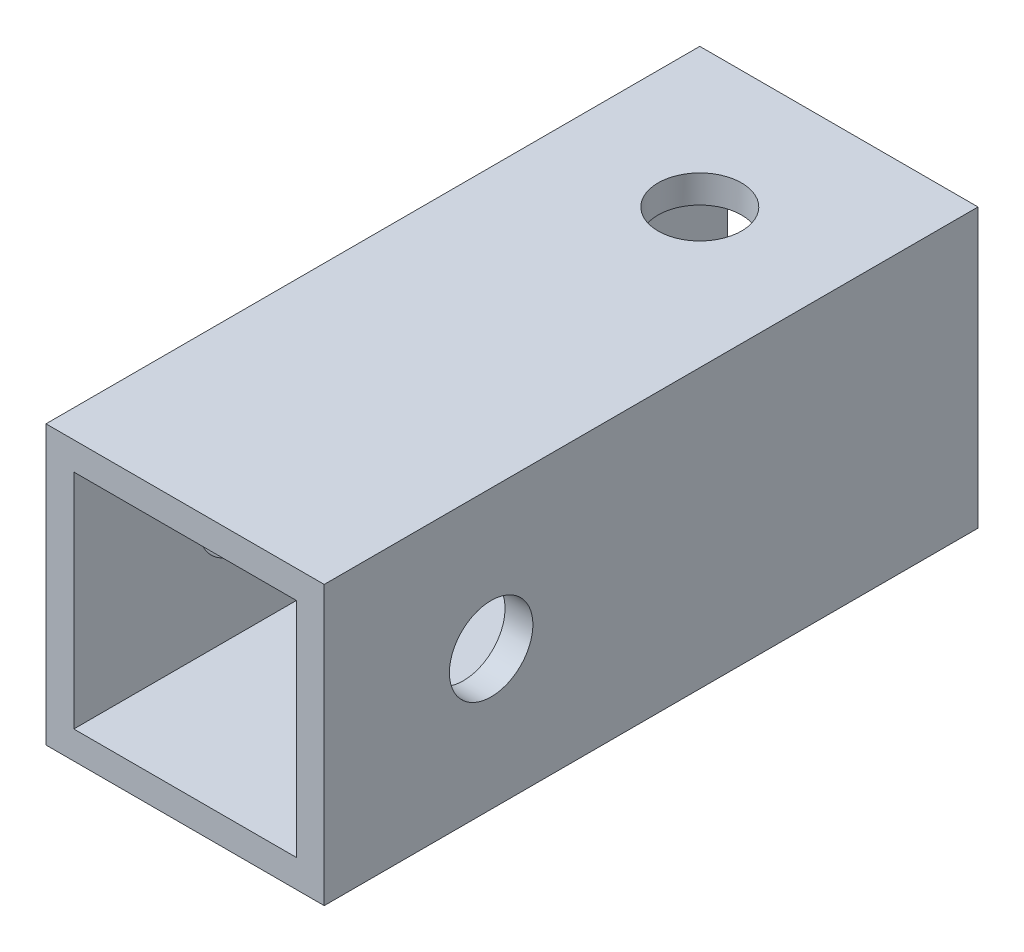
ISO-10303-21;
HEADER;
FILE_DESCRIPTION(('STEP AP214'),'2;1');
FILE_NAME('part.step','',(''),(''),'','','');
FILE_SCHEMA(('AUTOMOTIVE_DESIGN { 1 0 10303 214 1 1 1 1 }'));
ENDSEC;
DATA;
#1=APPLICATION_CONTEXT('core data for automotive mechanical design processes');
#2=APPLICATION_PROTOCOL_DEFINITION('international standard','automotive_design',2000,#1);
#3=PRODUCT_CONTEXT('',#1,'mechanical');
#4=PRODUCT('Part','Part','',(#3));
#5=PRODUCT_RELATED_PRODUCT_CATEGORY('part','',(#4));
#6=PRODUCT_DEFINITION_FORMATION('','',#4);
#7=PRODUCT_DEFINITION_CONTEXT('part definition',#1,'design');
#8=PRODUCT_DEFINITION('design','',#6,#7);
#9=PRODUCT_DEFINITION_SHAPE('','',#8);
#10=(LENGTH_UNIT() NAMED_UNIT(*) SI_UNIT(.MILLI.,.METRE.));
#11=(NAMED_UNIT(*) PLANE_ANGLE_UNIT() SI_UNIT($,.RADIAN.));
#12=(NAMED_UNIT(*) SI_UNIT($,.STERADIAN.) SOLID_ANGLE_UNIT());
#13=UNCERTAINTY_MEASURE_WITH_UNIT(LENGTH_MEASURE(1.E-05),#10,'distance_accuracy_value','');
#14=(GEOMETRIC_REPRESENTATION_CONTEXT(3) GLOBAL_UNCERTAINTY_ASSIGNED_CONTEXT((#13)) GLOBAL_UNIT_ASSIGNED_CONTEXT((#10,
#11,#12)) REPRESENTATION_CONTEXT('',''));
#15=CARTESIAN_POINT('',(0.,0.,0.));
#16=DIRECTION('',(0.,0.,1.));
#17=DIRECTION('',(1.,0.,0.));
#18=AXIS2_PLACEMENT_3D('',#15,#16,#17);
#19=CARTESIAN_POINT('',(0.,0.,23.5));
#20=DIRECTION('',(0.,0.,1.));
#21=DIRECTION('',(1.,0.,0.));
#22=AXIS2_PLACEMENT_3D('',#19,#20,#21);
#23=PLANE('',#22);
#24=DIRECTION('',(0.,1.,0.));
#25=VECTOR('',#24,1.);
#26=CARTESIAN_POINT('',(5.,-5.,23.5));
#27=LINE('',#26,#25);
#28=CARTESIAN_POINT('',(5.,-5.,23.5));
#29=VERTEX_POINT('',#28);
#30=CARTESIAN_POINT('',(5.,5.,23.5));
#31=VERTEX_POINT('',#30);
#32=EDGE_CURVE('E165',#29,#31,#27,.T.);
#33=ORIENTED_EDGE('',*,*,#32,.T.);
#34=DIRECTION('',(-1.,0.,0.));
#35=VECTOR('',#34,1.);
#36=CARTESIAN_POINT('',(-5.,5.,23.5));
#37=LINE('',#36,#35);
#38=CARTESIAN_POINT('',(-5.,5.,23.5));
#39=VERTEX_POINT('',#38);
#40=EDGE_CURVE('E168',#31,#39,#37,.T.);
#41=ORIENTED_EDGE('',*,*,#40,.T.);
#42=DIRECTION('',(0.,-1.,0.));
#43=VECTOR('',#42,1.);
#44=CARTESIAN_POINT('',(-5.,-5.,23.5));
#45=LINE('',#44,#43);
#46=CARTESIAN_POINT('',(-5.,-5.,23.5));
#47=VERTEX_POINT('',#46);
#48=EDGE_CURVE('E171',#39,#47,#45,.T.);
#49=ORIENTED_EDGE('',*,*,#48,.T.);
#50=DIRECTION('',(1.,0.,0.));
#51=VECTOR('',#50,1.);
#52=CARTESIAN_POINT('',(-5.,-5.,23.5));
#53=LINE('',#52,#51);
#54=EDGE_CURVE('E173',#47,#29,#53,.T.);
#55=ORIENTED_EDGE('',*,*,#54,.T.);
#56=EDGE_LOOP('',(#33,#41,#49,#55));
#57=FACE_BOUND('',#56,.T.);
#58=DIRECTION('',(-1.,0.,0.));
#59=VECTOR('',#58,1.);
#60=CARTESIAN_POINT('',(0.,4.,23.5));
#61=LINE('',#60,#59);
#62=CARTESIAN_POINT('',(4.,4.,23.5));
#63=VERTEX_POINT('',#62);
#64=CARTESIAN_POINT('',(-4.,4.,23.5));
#65=VERTEX_POINT('',#64);
#66=EDGE_CURVE('E135',#63,#65,#61,.T.);
#67=ORIENTED_EDGE('',*,*,#66,.F.);
#68=DIRECTION('',(0.,1.,0.));
#69=VECTOR('',#68,1.);
#70=CARTESIAN_POINT('',(4.,0.,23.5));
#71=LINE('',#70,#69);
#72=CARTESIAN_POINT('',(4.,-4.,23.5));
#73=VERTEX_POINT('',#72);
#74=EDGE_CURVE('E127',#73,#63,#71,.T.);
#75=ORIENTED_EDGE('',*,*,#74,.F.);
#76=DIRECTION('',(1.,0.,0.));
#77=VECTOR('',#76,1.);
#78=CARTESIAN_POINT('',(0.,-4.,23.5));
#79=LINE('',#78,#77);
#80=CARTESIAN_POINT('',(-4.,-4.,23.5));
#81=VERTEX_POINT('',#80);
#82=EDGE_CURVE('E149',#81,#73,#79,.T.);
#83=ORIENTED_EDGE('',*,*,#82,.F.);
#84=DIRECTION('',(0.,-1.,0.));
#85=VECTOR('',#84,1.);
#86=CARTESIAN_POINT('',(-4.,0.,23.5));
#87=LINE('',#86,#85);
#88=EDGE_CURVE('E147',#65,#81,#87,.T.);
#89=ORIENTED_EDGE('',*,*,#88,.F.);
#90=EDGE_LOOP('',(#67,#75,#83,#89));
#91=FACE_BOUND('',#90,.T.);
#92=ADVANCED_FACE('F60',(#57,#91),#23,.T.);
#93=CARTESIAN_POINT('',(0.,0.,0.));
#94=DIRECTION('',(0.,0.,1.));
#95=DIRECTION('',(1.,0.,0.));
#96=AXIS2_PLACEMENT_3D('',#93,#94,#95);
#97=PLANE('',#96);
#98=DIRECTION('',(0.,1.,0.));
#99=VECTOR('',#98,1.);
#100=CARTESIAN_POINT('',(5.,-5.,0.));
#101=LINE('',#100,#99);
#102=CARTESIAN_POINT('',(5.,-5.,0.));
#103=VERTEX_POINT('',#102);
#104=CARTESIAN_POINT('',(5.,5.,0.));
#105=VERTEX_POINT('',#104);
#106=EDGE_CURVE('E143',#103,#105,#101,.T.);
#107=ORIENTED_EDGE('',*,*,#106,.F.);
#108=DIRECTION('',(1.,0.,0.));
#109=VECTOR('',#108,1.);
#110=CARTESIAN_POINT('',(-5.,-5.,0.));
#111=LINE('',#110,#109);
#112=CARTESIAN_POINT('',(-5.,-5.,0.));
#113=VERTEX_POINT('',#112);
#114=EDGE_CURVE('E169',#113,#103,#111,.T.);
#115=ORIENTED_EDGE('',*,*,#114,.F.);
#116=DIRECTION('',(0.,-1.,0.));
#117=VECTOR('',#116,1.);
#118=CARTESIAN_POINT('',(-5.,-5.,0.));
#119=LINE('',#118,#117);
#120=CARTESIAN_POINT('',(-5.,5.,0.));
#121=VERTEX_POINT('',#120);
#122=EDGE_CURVE('E180',#121,#113,#119,.T.);
#123=ORIENTED_EDGE('',*,*,#122,.F.);
#124=DIRECTION('',(-1.,0.,0.));
#125=VECTOR('',#124,1.);
#126=CARTESIAN_POINT('',(-5.,5.,0.));
#127=LINE('',#126,#125);
#128=EDGE_CURVE('E178',#105,#121,#127,.T.);
#129=ORIENTED_EDGE('',*,*,#128,.F.);
#130=EDGE_LOOP('',(#107,#115,#123,#129));
#131=FACE_BOUND('',#130,.T.);
#132=DIRECTION('',(0.,1.,0.));
#133=VECTOR('',#132,1.);
#134=CARTESIAN_POINT('',(4.,0.,0.));
#135=LINE('',#134,#133);
#136=CARTESIAN_POINT('',(4.,-4.,0.));
#137=VERTEX_POINT('',#136);
#138=CARTESIAN_POINT('',(4.,4.,0.));
#139=VERTEX_POINT('',#138);
#140=EDGE_CURVE('E85',#137,#139,#135,.T.);
#141=ORIENTED_EDGE('',*,*,#140,.T.);
#142=DIRECTION('',(-1.,0.,0.));
#143=VECTOR('',#142,1.);
#144=CARTESIAN_POINT('',(0.,4.,0.));
#145=LINE('',#144,#143);
#146=CARTESIAN_POINT('',(-4.,4.,0.));
#147=VERTEX_POINT('',#146);
#148=EDGE_CURVE('E142',#139,#147,#145,.T.);
#149=ORIENTED_EDGE('',*,*,#148,.T.);
#150=DIRECTION('',(0.,-1.,0.));
#151=VECTOR('',#150,1.);
#152=CARTESIAN_POINT('',(-4.,0.,0.));
#153=LINE('',#152,#151);
#154=CARTESIAN_POINT('',(-4.,-4.,0.));
#155=VERTEX_POINT('',#154);
#156=EDGE_CURVE('E157',#147,#155,#153,.T.);
#157=ORIENTED_EDGE('',*,*,#156,.T.);
#158=DIRECTION('',(1.,0.,0.));
#159=VECTOR('',#158,1.);
#160=CARTESIAN_POINT('',(0.,-4.,0.));
#161=LINE('',#160,#159);
#162=EDGE_CURVE('E136',#155,#137,#161,.T.);
#163=ORIENTED_EDGE('',*,*,#162,.T.);
#164=EDGE_LOOP('',(#141,#149,#157,#163));
#165=FACE_BOUND('',#164,.T.);
#166=ADVANCED_FACE('F226',(#131,#165),#97,.F.);
#167=CARTESIAN_POINT('',(5.,-5.,23.5));
#168=DIRECTION('',(-1.,0.,0.));
#169=DIRECTION('',(0.,0.,1.));
#170=AXIS2_PLACEMENT_3D('',#167,#168,#169);
#171=PLANE('',#170);
#172=CARTESIAN_POINT('',(5.,0.,17.5));
#173=DIRECTION('',(-1.,0.,0.));
#174=DIRECTION('',(0.,0.,1.));
#175=AXIS2_PLACEMENT_3D('',#172,#173,#174);
#176=CIRCLE('',#175,1.5);
#177=CARTESIAN_POINT('',(5.,0.,19.));
#178=VERTEX_POINT('',#177);
#179=EDGE_CURVE('E209',#178,#178,#176,.T.);
#180=ORIENTED_EDGE('',*,*,#179,.T.);
#181=EDGE_LOOP('',(#180));
#182=FACE_BOUND('',#181,.T.);
#183=ORIENTED_EDGE('',*,*,#106,.T.);
#184=DIRECTION('',(0.,0.,-1.));
#185=VECTOR('',#184,1.);
#186=CARTESIAN_POINT('',(5.,5.,23.5));
#187=LINE('',#186,#185);
#188=EDGE_CURVE('E12',#31,#105,#187,.T.);
#189=ORIENTED_EDGE('',*,*,#188,.F.);
#190=ORIENTED_EDGE('',*,*,#32,.F.);
#191=DIRECTION('',(0.,0.,-1.));
#192=VECTOR('',#191,1.);
#193=CARTESIAN_POINT('',(5.,-5.,23.5));
#194=LINE('',#193,#192);
#195=EDGE_CURVE('E175',#29,#103,#194,.T.);
#196=ORIENTED_EDGE('',*,*,#195,.T.);
#197=EDGE_LOOP('',(#183,#189,#190,#196));
#198=FACE_BOUND('',#197,.T.);
#199=ADVANCED_FACE('F62',(#182,#198),#171,.F.);
#200=CARTESIAN_POINT('',(-5.,5.,23.5));
#201=DIRECTION('',(0.,-1.,0.));
#202=DIRECTION('',(0.,0.,-1.));
#203=AXIS2_PLACEMENT_3D('',#200,#201,#202);
#204=PLANE('',#203);
#205=CARTESIAN_POINT('',(0.,5.,5.));
#206=DIRECTION('',(0.,1.,0.));
#207=DIRECTION('',(0.,0.,1.));
#208=AXIS2_PLACEMENT_3D('',#205,#206,#207);
#209=CIRCLE('',#208,1.5);
#210=CARTESIAN_POINT('',(0.,5.,6.5));
#211=VERTEX_POINT('',#210);
#212=EDGE_CURVE('E196',#211,#211,#209,.T.);
#213=ORIENTED_EDGE('',*,*,#212,.F.);
#214=EDGE_LOOP('',(#213));
#215=FACE_BOUND('',#214,.T.);
#216=ORIENTED_EDGE('',*,*,#128,.T.);
#217=DIRECTION('',(0.,0.,-1.));
#218=VECTOR('',#217,1.);
#219=CARTESIAN_POINT('',(-5.,5.,23.5));
#220=LINE('',#219,#218);
#221=EDGE_CURVE('E69',#39,#121,#220,.T.);
#222=ORIENTED_EDGE('',*,*,#221,.F.);
#223=ORIENTED_EDGE('',*,*,#40,.F.);
#224=ORIENTED_EDGE('',*,*,#188,.T.);
#225=EDGE_LOOP('',(#216,#222,#223,#224));
#226=FACE_BOUND('',#225,.T.);
#227=ADVANCED_FACE('F252',(#215,#226),#204,.F.);
#228=CARTESIAN_POINT('',(-5.,-5.,23.5));
#229=DIRECTION('',(1.,0.,0.));
#230=DIRECTION('',(0.,0.,-1.));
#231=AXIS2_PLACEMENT_3D('',#228,#229,#230);
#232=PLANE('',#231);
#233=CARTESIAN_POINT('',(-5.,0.,17.5));
#234=DIRECTION('',(-1.,0.,0.));
#235=DIRECTION('',(0.,0.,1.));
#236=AXIS2_PLACEMENT_3D('',#233,#234,#235);
#237=CIRCLE('',#236,1.5);
#238=CARTESIAN_POINT('',(-5.,0.,19.));
#239=VERTEX_POINT('',#238);
#240=EDGE_CURVE('E206',#239,#239,#237,.T.);
#241=ORIENTED_EDGE('',*,*,#240,.F.);
#242=EDGE_LOOP('',(#241));
#243=FACE_BOUND('',#242,.T.);
#244=ORIENTED_EDGE('',*,*,#122,.T.);
#245=DIRECTION('',(0.,0.,-1.));
#246=VECTOR('',#245,1.);
#247=CARTESIAN_POINT('',(-5.,-5.,23.5));
#248=LINE('',#247,#246);
#249=EDGE_CURVE('E185',#47,#113,#248,.T.);
#250=ORIENTED_EDGE('',*,*,#249,.F.);
#251=ORIENTED_EDGE('',*,*,#48,.F.);
#252=ORIENTED_EDGE('',*,*,#221,.T.);
#253=EDGE_LOOP('',(#244,#250,#251,#252));
#254=FACE_BOUND('',#253,.T.);
#255=ADVANCED_FACE('F250',(#243,#254),#232,.F.);
#256=CARTESIAN_POINT('',(-5.,-5.,23.5));
#257=DIRECTION('',(0.,1.,0.));
#258=DIRECTION('',(0.,0.,1.));
#259=AXIS2_PLACEMENT_3D('',#256,#257,#258);
#260=PLANE('',#259);
#261=CARTESIAN_POINT('',(0.,-5.,5.));
#262=DIRECTION('',(0.,1.,0.));
#263=DIRECTION('',(0.,0.,1.));
#264=AXIS2_PLACEMENT_3D('',#261,#262,#263);
#265=CIRCLE('',#264,1.5);
#266=CARTESIAN_POINT('',(0.,-5.,6.5));
#267=VERTEX_POINT('',#266);
#268=EDGE_CURVE('E191',#267,#267,#265,.T.);
#269=ORIENTED_EDGE('',*,*,#268,.T.);
#270=EDGE_LOOP('',(#269));
#271=FACE_BOUND('',#270,.T.);
#272=ORIENTED_EDGE('',*,*,#114,.T.);
#273=ORIENTED_EDGE('',*,*,#195,.F.);
#274=ORIENTED_EDGE('',*,*,#54,.F.);
#275=ORIENTED_EDGE('',*,*,#249,.T.);
#276=EDGE_LOOP('',(#272,#273,#274,#275));
#277=FACE_BOUND('',#276,.T.);
#278=ADVANCED_FACE('F247',(#271,#277),#260,.F.);
#279=CARTESIAN_POINT('',(4.,0.,23.5));
#280=DIRECTION('',(-1.,0.,0.));
#281=DIRECTION('',(0.,0.,1.));
#282=AXIS2_PLACEMENT_3D('',#279,#280,#281);
#283=PLANE('',#282);
#284=CARTESIAN_POINT('',(4.,0.,17.5));
#285=DIRECTION('',(-1.,0.,0.));
#286=DIRECTION('',(0.,0.,1.));
#287=AXIS2_PLACEMENT_3D('',#284,#285,#286);
#288=CIRCLE('',#287,1.5);
#289=CARTESIAN_POINT('',(4.,0.,19.));
#290=VERTEX_POINT('',#289);
#291=EDGE_CURVE('E201',#290,#290,#288,.T.);
#292=ORIENTED_EDGE('',*,*,#291,.F.);
#293=EDGE_LOOP('',(#292));
#294=FACE_BOUND('',#293,.T.);
#295=ORIENTED_EDGE('',*,*,#140,.F.);
#296=DIRECTION('',(0.,0.,-1.));
#297=VECTOR('',#296,1.);
#298=CARTESIAN_POINT('',(4.,-4.,23.5));
#299=LINE('',#298,#297);
#300=EDGE_CURVE('E131',#73,#137,#299,.T.);
#301=ORIENTED_EDGE('',*,*,#300,.F.);
#302=ORIENTED_EDGE('',*,*,#74,.T.);
#303=DIRECTION('',(0.,0.,-1.));
#304=VECTOR('',#303,1.);
#305=CARTESIAN_POINT('',(4.,4.,23.5));
#306=LINE('',#305,#304);
#307=EDGE_CURVE('E130',#63,#139,#306,.T.);
#308=ORIENTED_EDGE('',*,*,#307,.T.);
#309=EDGE_LOOP('',(#295,#301,#302,#308));
#310=FACE_BOUND('',#309,.T.);
#311=ADVANCED_FACE('F129',(#294,#310),#283,.T.);
#312=CARTESIAN_POINT('',(0.,4.,23.5));
#313=DIRECTION('',(0.,-1.,0.));
#314=DIRECTION('',(0.,0.,-1.));
#315=AXIS2_PLACEMENT_3D('',#312,#313,#314);
#316=PLANE('',#315);
#317=CARTESIAN_POINT('',(0.,4.,5.));
#318=DIRECTION('',(0.,-1.,0.));
#319=DIRECTION('',(0.,0.,-1.));
#320=AXIS2_PLACEMENT_3D('',#317,#318,#319);
#321=CIRCLE('',#320,1.5);
#322=CARTESIAN_POINT('',(0.,4.,3.5));
#323=VERTEX_POINT('',#322);
#324=EDGE_CURVE('E155',#323,#323,#321,.T.);
#325=ORIENTED_EDGE('',*,*,#324,.F.);
#326=EDGE_LOOP('',(#325));
#327=FACE_BOUND('',#326,.T.);
#328=ORIENTED_EDGE('',*,*,#148,.F.);
#329=ORIENTED_EDGE('',*,*,#307,.F.);
#330=ORIENTED_EDGE('',*,*,#66,.T.);
#331=DIRECTION('',(0.,0.,-1.));
#332=VECTOR('',#331,1.);
#333=CARTESIAN_POINT('',(-4.,4.,23.5));
#334=LINE('',#333,#332);
#335=EDGE_CURVE('E144',#65,#147,#334,.T.);
#336=ORIENTED_EDGE('',*,*,#335,.T.);
#337=EDGE_LOOP('',(#328,#329,#330,#336));
#338=FACE_BOUND('',#337,.T.);
#339=ADVANCED_FACE('F139',(#327,#338),#316,.T.);
#340=CARTESIAN_POINT('',(-4.,0.,23.5));
#341=DIRECTION('',(1.,0.,0.));
#342=DIRECTION('',(0.,0.,-1.));
#343=AXIS2_PLACEMENT_3D('',#340,#341,#342);
#344=PLANE('',#343);
#345=CARTESIAN_POINT('',(-4.,0.,17.5));
#346=DIRECTION('',(1.,0.,0.));
#347=DIRECTION('',(0.,0.,-1.));
#348=AXIS2_PLACEMENT_3D('',#345,#346,#347);
#349=CIRCLE('',#348,1.5);
#350=CARTESIAN_POINT('',(-4.,0.,16.));
#351=VERTEX_POINT('',#350);
#352=EDGE_CURVE('E64',#351,#351,#349,.T.);
#353=ORIENTED_EDGE('',*,*,#352,.F.);
#354=EDGE_LOOP('',(#353));
#355=FACE_BOUND('',#354,.T.);
#356=ORIENTED_EDGE('',*,*,#156,.F.);
#357=ORIENTED_EDGE('',*,*,#335,.F.);
#358=ORIENTED_EDGE('',*,*,#88,.T.);
#359=DIRECTION('',(0.,0.,-1.));
#360=VECTOR('',#359,1.);
#361=CARTESIAN_POINT('',(-4.,-4.,23.5));
#362=LINE('',#361,#360);
#363=EDGE_CURVE('E77',#81,#155,#362,.T.);
#364=ORIENTED_EDGE('',*,*,#363,.T.);
#365=EDGE_LOOP('',(#356,#357,#358,#364));
#366=FACE_BOUND('',#365,.T.);
#367=ADVANCED_FACE('F219',(#355,#366),#344,.T.);
#368=CARTESIAN_POINT('',(0.,-4.,23.5));
#369=DIRECTION('',(0.,1.,0.));
#370=DIRECTION('',(0.,0.,1.));
#371=AXIS2_PLACEMENT_3D('',#368,#369,#370);
#372=PLANE('',#371);
#373=CARTESIAN_POINT('',(0.,-4.,5.));
#374=DIRECTION('',(0.,1.,0.));
#375=DIRECTION('',(0.,0.,1.));
#376=AXIS2_PLACEMENT_3D('',#373,#374,#375);
#377=CIRCLE('',#376,1.5);
#378=CARTESIAN_POINT('',(0.,-4.,6.5));
#379=VERTEX_POINT('',#378);
#380=EDGE_CURVE('E189',#379,#379,#377,.T.);
#381=ORIENTED_EDGE('',*,*,#380,.F.);
#382=EDGE_LOOP('',(#381));
#383=FACE_BOUND('',#382,.T.);
#384=ORIENTED_EDGE('',*,*,#162,.F.);
#385=ORIENTED_EDGE('',*,*,#363,.F.);
#386=ORIENTED_EDGE('',*,*,#82,.T.);
#387=ORIENTED_EDGE('',*,*,#300,.T.);
#388=EDGE_LOOP('',(#384,#385,#386,#387));
#389=FACE_BOUND('',#388,.T.);
#390=ADVANCED_FACE('F222',(#383,#389),#372,.T.);
#391=CARTESIAN_POINT('',(0.,-5.,5.));
#392=DIRECTION('',(0.,1.,0.));
#393=DIRECTION('',(0.,0.,1.));
#394=AXIS2_PLACEMENT_3D('',#391,#392,#393);
#395=CYLINDRICAL_SURFACE('',#394,1.5);
#396=ORIENTED_EDGE('',*,*,#380,.T.);
#397=EDGE_LOOP('',(#396));
#398=FACE_BOUND('',#397,.T.);
#399=ORIENTED_EDGE('',*,*,#268,.F.);
#400=EDGE_LOOP('',(#399));
#401=FACE_BOUND('',#400,.T.);
#402=ADVANCED_FACE('F228',(#398,#401),#395,.F.);
#403=ORIENTED_EDGE('',*,*,#324,.T.);
#404=EDGE_LOOP('',(#403));
#405=FACE_BOUND('',#404,.T.);
#406=ORIENTED_EDGE('',*,*,#212,.T.);
#407=EDGE_LOOP('',(#406));
#408=FACE_BOUND('',#407,.T.);
#409=ADVANCED_FACE('F234',(#405,#408),#395,.F.);
#410=CARTESIAN_POINT('',(5.,0.,17.5));
#411=DIRECTION('',(-1.,0.,0.));
#412=DIRECTION('',(0.,0.,1.));
#413=AXIS2_PLACEMENT_3D('',#410,#411,#412);
#414=CYLINDRICAL_SURFACE('',#413,1.5);
#415=ORIENTED_EDGE('',*,*,#352,.T.);
#416=EDGE_LOOP('',(#415));
#417=FACE_BOUND('',#416,.T.);
#418=ORIENTED_EDGE('',*,*,#240,.T.);
#419=EDGE_LOOP('',(#418));
#420=FACE_BOUND('',#419,.T.);
#421=ADVANCED_FACE('F216',(#417,#420),#414,.F.);
#422=ORIENTED_EDGE('',*,*,#291,.T.);
#423=EDGE_LOOP('',(#422));
#424=FACE_BOUND('',#423,.T.);
#425=ORIENTED_EDGE('',*,*,#179,.F.);
#426=EDGE_LOOP('',(#425));
#427=FACE_BOUND('',#426,.T.);
#428=ADVANCED_FACE('F280',(#424,#427),#414,.F.);
#429=CLOSED_SHELL('',(#92,#166,#199,#227,#255,#278,#311,#339,#367,#390,#402,#409,#421,#428));
#430=MANIFOLD_SOLID_BREP('B2',#429);
#431=ADVANCED_BREP_SHAPE_REPRESENTATION('',(#18,#430),#14);
#432=SHAPE_DEFINITION_REPRESENTATION(#9,#431);
ENDSEC;
END-ISO-10303-21;
